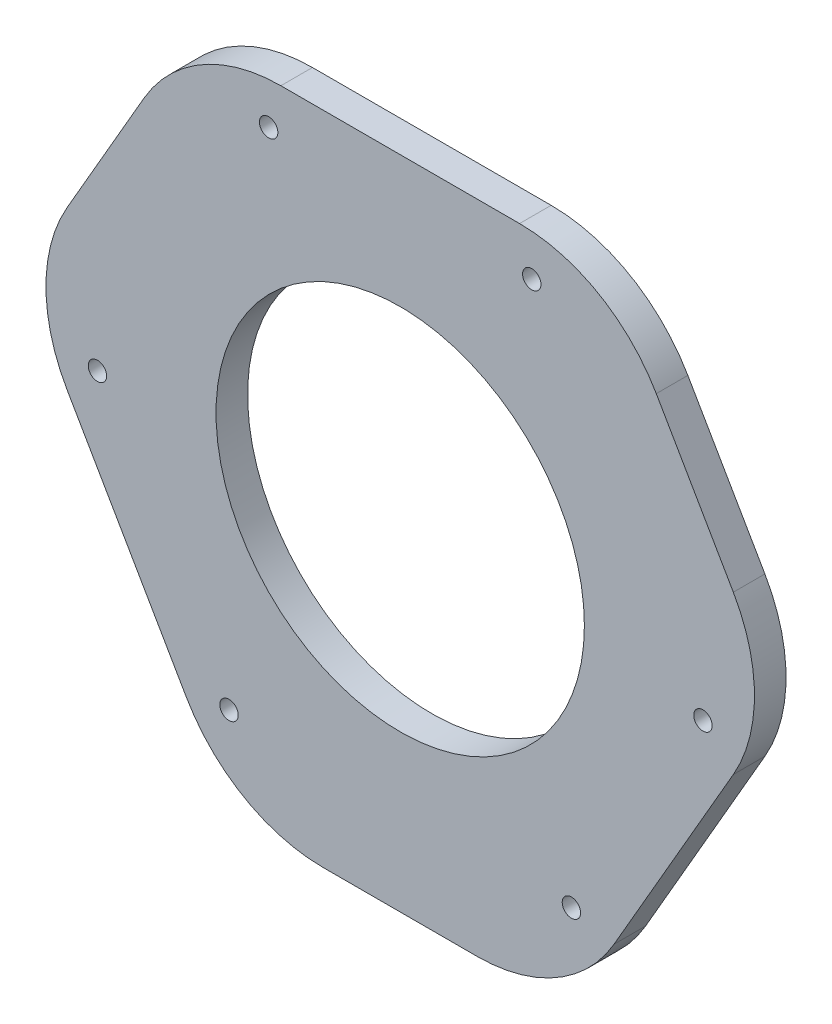
ISO-10303-21;
HEADER;
FILE_DESCRIPTION(('STEP AP214'),'2;1');
FILE_NAME('part.step','',(''),(''),'','','');
FILE_SCHEMA(('AUTOMOTIVE_DESIGN { 1 0 10303 214 1 1 1 1 }'));
ENDSEC;
DATA;
#1=APPLICATION_CONTEXT('core data for automotive mechanical design processes');
#2=APPLICATION_PROTOCOL_DEFINITION('international standard','automotive_design',2000,#1);
#3=PRODUCT_CONTEXT('',#1,'mechanical');
#4=PRODUCT('Part','Part','',(#3));
#5=PRODUCT_RELATED_PRODUCT_CATEGORY('part','',(#4));
#6=PRODUCT_DEFINITION_FORMATION('','',#4);
#7=PRODUCT_DEFINITION_CONTEXT('part definition',#1,'design');
#8=PRODUCT_DEFINITION('design','',#6,#7);
#9=PRODUCT_DEFINITION_SHAPE('','',#8);
#10=(LENGTH_UNIT() NAMED_UNIT(*) SI_UNIT(.MILLI.,.METRE.));
#11=(NAMED_UNIT(*) PLANE_ANGLE_UNIT() SI_UNIT($,.RADIAN.));
#12=(NAMED_UNIT(*) SI_UNIT($,.STERADIAN.) SOLID_ANGLE_UNIT());
#13=UNCERTAINTY_MEASURE_WITH_UNIT(LENGTH_MEASURE(1.E-05),#10,'distance_accuracy_value','');
#14=(GEOMETRIC_REPRESENTATION_CONTEXT(3) GLOBAL_UNCERTAINTY_ASSIGNED_CONTEXT((#13)) GLOBAL_UNIT_ASSIGNED_CONTEXT((#10,
#11,#12)) REPRESENTATION_CONTEXT('',''));
#15=CARTESIAN_POINT('',(0.,0.,0.));
#16=DIRECTION('',(0.,0.,1.));
#17=DIRECTION('',(1.,0.,0.));
#18=AXIS2_PLACEMENT_3D('',#15,#16,#17);
#19=CARTESIAN_POINT('',(0.,0.,6.));
#20=DIRECTION('',(0.,0.,1.));
#21=DIRECTION('',(1.,0.,0.));
#22=AXIS2_PLACEMENT_3D('',#19,#20,#21);
#23=PLANE('',#22);
#24=CARTESIAN_POINT('',(32.5333209967932,-47.6506350946074,6.));
#25=DIRECTION('',(0.,0.,1.));
#26=DIRECTION('',(1.,0.,0.));
#27=AXIS2_PLACEMENT_3D('',#24,#25,#26);
#28=CIRCLE('',#27,1.75);
#29=CARTESIAN_POINT('',(34.2833209967932,-47.6506350946074,6.));
#30=VERTEX_POINT('',#29);
#31=EDGE_CURVE('E283',#30,#30,#28,.F.);
#32=ORIENTED_EDGE('',*,*,#31,.T.);
#33=EDGE_LOOP('',(#32));
#34=FACE_BOUND('',#33,.T.);
#35=CARTESIAN_POINT('',(57.5333209967932,-4.34936490538549,6.));
#36=DIRECTION('',(0.,0.,1.));
#37=DIRECTION('',(1.,0.,0.));
#38=AXIS2_PLACEMENT_3D('',#35,#36,#37);
#39=CIRCLE('',#38,1.75);
#40=CARTESIAN_POINT('',(59.2833209967932,-4.34936490538549,6.));
#41=VERTEX_POINT('',#40);
#42=EDGE_CURVE('E287',#41,#41,#39,.T.);
#43=ORIENTED_EDGE('',*,*,#42,.F.);
#44=EDGE_LOOP('',(#43));
#45=FACE_BOUND('',#44,.T.);
#46=CARTESIAN_POINT('',(0.,0.,6.));
#47=DIRECTION('',(0.,0.,1.));
#48=DIRECTION('',(1.,0.,0.));
#49=AXIS2_PLACEMENT_3D('',#46,#47,#48);
#50=CIRCLE('',#49,35.);
#51=CARTESIAN_POINT('',(35.,0.,6.));
#52=VERTEX_POINT('',#51);
#53=EDGE_CURVE('E291',#52,#52,#50,.T.);
#54=ORIENTED_EDGE('',*,*,#53,.F.);
#55=EDGE_LOOP('',(#54));
#56=FACE_BOUND('',#55,.T.);
#57=CARTESIAN_POINT('',(-25.,52.,6.));
#58=DIRECTION('',(0.,0.,1.));
#59=DIRECTION('',(1.,0.,0.));
#60=AXIS2_PLACEMENT_3D('',#57,#58,#59);
#61=CIRCLE('',#60,1.75);
#62=CARTESIAN_POINT('',(-23.25,52.,6.));
#63=VERTEX_POINT('',#62);
#64=EDGE_CURVE('E295',#63,#63,#61,.T.);
#65=ORIENTED_EDGE('',*,*,#64,.F.);
#66=EDGE_LOOP('',(#65));
#67=FACE_BOUND('',#66,.T.);
#68=CARTESIAN_POINT('',(25.,52.,6.));
#69=DIRECTION('',(0.,0.,1.));
#70=DIRECTION('',(1.,0.,0.));
#71=AXIS2_PLACEMENT_3D('',#68,#69,#70);
#72=CIRCLE('',#71,1.75);
#73=CARTESIAN_POINT('',(26.75,52.,6.));
#74=VERTEX_POINT('',#73);
#75=EDGE_CURVE('E299',#74,#74,#72,.F.);
#76=ORIENTED_EDGE('',*,*,#75,.T.);
#77=EDGE_LOOP('',(#76));
#78=FACE_BOUND('',#77,.T.);
#79=CARTESIAN_POINT('',(-32.5333209967865,-47.6506350946113,6.));
#80=DIRECTION('',(0.,0.,1.));
#81=DIRECTION('',(1.,0.,0.));
#82=AXIS2_PLACEMENT_3D('',#79,#80,#81);
#83=CIRCLE('',#82,1.75);
#84=CARTESIAN_POINT('',(-30.7833209967865,-47.6506350946113,6.));
#85=VERTEX_POINT('',#84);
#86=EDGE_CURVE('E302',#85,#85,#83,.T.);
#87=ORIENTED_EDGE('',*,*,#86,.F.);
#88=EDGE_LOOP('',(#87));
#89=FACE_BOUND('',#88,.T.);
#90=CARTESIAN_POINT('',(-57.5333209967866,-4.34936490538938,6.));
#91=DIRECTION('',(0.,0.,1.));
#92=DIRECTION('',(1.,0.,0.));
#93=AXIS2_PLACEMENT_3D('',#90,#91,#92);
#94=CIRCLE('',#93,1.75);
#95=CARTESIAN_POINT('',(-55.7833209967865,-4.34936490538938,6.));
#96=VERTEX_POINT('',#95);
#97=EDGE_CURVE('E228',#96,#96,#94,.F.);
#98=ORIENTED_EDGE('',*,*,#97,.T.);
#99=EDGE_LOOP('',(#98));
#100=FACE_BOUND('',#99,.T.);
#101=DIRECTION('',(-0.5,-0.866025403784439,0.));
#102=VECTOR('',#101,1.);
#103=CARTESIAN_POINT('',(-55.9807621135332,32.3205080756888,6.));
#104=LINE('',#103,#102);
#105=CARTESIAN_POINT('',(-48.6602540378444,45.,6.));
#106=VERTEX_POINT('',#105);
#107=CARTESIAN_POINT('',(-63.3012701892218,19.6410161513778,6.));
#108=VERTEX_POINT('',#107);
#109=EDGE_CURVE('E260',#106,#108,#104,.T.);
#110=ORIENTED_EDGE('',*,*,#109,.T.);
#111=CARTESIAN_POINT('',(-37.3205080756887,4.6410161513779,6.));
#112=DIRECTION('',(0.,0.,1.));
#113=DIRECTION('',(-0.499999999999992,0.866025403784443,0.));
#114=AXIS2_PLACEMENT_3D('',#111,#112,#113);
#115=CIRCLE('',#114,30.);
#116=CARTESIAN_POINT('',(-63.301270189222,-10.3589838486219,6.));
#117=VERTEX_POINT('',#116);
#118=EDGE_CURVE('E60',#108,#117,#115,.T.);
#119=ORIENTED_EDGE('',*,*,#118,.T.);
#120=DIRECTION('',(-0.5,0.866025403784438,0.));
#121=VECTOR('',#120,1.);
#122=CARTESIAN_POINT('',(-51.9615242270641,-29.9999999999987,6.));
#123=LINE('',#122,#121);
#124=CARTESIAN_POINT('',(-40.6217782649111,-49.6410161513772,6.));
#125=VERTEX_POINT('',#124);
#126=EDGE_CURVE('E267',#125,#117,#123,.T.);
#127=ORIENTED_EDGE('',*,*,#126,.F.);
#128=CARTESIAN_POINT('',(-14.6410161513779,-34.6410161513774,6.));
#129=DIRECTION('',(0.,0.,1.));
#130=DIRECTION('',(-0.499999999999992,0.866025403784443,0.));
#131=AXIS2_PLACEMENT_3D('',#128,#129,#130);
#132=CIRCLE('',#131,30.);
#133=CARTESIAN_POINT('',(-14.6410161513781,-64.6410161513774,6.));
#134=VERTEX_POINT('',#133);
#135=EDGE_CURVE('E358',#125,#134,#132,.T.);
#136=ORIENTED_EDGE('',*,*,#135,.T.);
#137=DIRECTION('',(1.,0.,0.));
#138=VECTOR('',#137,1.);
#139=CARTESIAN_POINT('',(0.,-64.641016151375,6.));
#140=LINE('',#139,#138);
#141=CARTESIAN_POINT('',(14.6410161513772,-64.6410161513776,6.));
#142=VERTEX_POINT('',#141);
#143=EDGE_CURVE('E272',#134,#142,#140,.T.);
#144=ORIENTED_EDGE('',*,*,#143,.T.);
#145=CARTESIAN_POINT('',(14.6410161513774,-34.6410161513776,6.));
#146=DIRECTION('',(0.,0.,1.));
#147=DIRECTION('',(-0.500000000000004,-0.866025403784436,0.));
#148=AXIS2_PLACEMENT_3D('',#145,#146,#147);
#149=CIRCLE('',#148,30.);
#150=CARTESIAN_POINT('',(40.6217782649105,-49.6410161513777,6.));
#151=VERTEX_POINT('',#150);
#152=EDGE_CURVE('E342',#142,#151,#149,.T.);
#153=ORIENTED_EDGE('',*,*,#152,.T.);
#154=DIRECTION('',(-0.5,-0.866025403784439,0.));
#155=VECTOR('',#154,1.);
#156=CARTESIAN_POINT('',(51.9615242270641,-29.9999999999987,6.));
#157=LINE('',#156,#155);
#158=CARTESIAN_POINT('',(63.3012701892219,-10.3589838486227,6.));
#159=VERTEX_POINT('',#158);
#160=EDGE_CURVE('E279',#159,#151,#157,.T.);
#161=ORIENTED_EDGE('',*,*,#160,.F.);
#162=CARTESIAN_POINT('',(37.3205080756888,4.64101615137739,6.));
#163=DIRECTION('',(0.,0.,1.));
#164=DIRECTION('',(-0.500000000000004,-0.866025403784436,0.));
#165=AXIS2_PLACEMENT_3D('',#162,#163,#164);
#166=CIRCLE('',#165,30.);
#167=CARTESIAN_POINT('',(63.301270189222,19.6410161513773,6.));
#168=VERTEX_POINT('',#167);
#169=EDGE_CURVE('E323',#159,#168,#166,.T.);
#170=ORIENTED_EDGE('',*,*,#169,.T.);
#171=DIRECTION('',(-0.5,0.866025403784439,0.));
#172=VECTOR('',#171,1.);
#173=CARTESIAN_POINT('',(55.9807621135332,32.3205080756888,6.));
#174=LINE('',#173,#172);
#175=CARTESIAN_POINT('',(48.6602540378444,45.,6.));
#176=VERTEX_POINT('',#175);
#177=EDGE_CURVE('E223',#168,#176,#174,.T.);
#178=ORIENTED_EDGE('',*,*,#177,.T.);
#179=CARTESIAN_POINT('',(22.6794919243112,30.,6.));
#180=DIRECTION('',(0.,0.,1.));
#181=DIRECTION('',(1.,0.,0.));
#182=AXIS2_PLACEMENT_3D('',#179,#180,#181);
#183=CIRCLE('',#182,30.);
#184=CARTESIAN_POINT('',(22.6794919243112,60.,6.));
#185=VERTEX_POINT('',#184);
#186=EDGE_CURVE('E51',#176,#185,#183,.T.);
#187=ORIENTED_EDGE('',*,*,#186,.T.);
#188=DIRECTION('',(1.,0.,0.));
#189=VECTOR('',#188,1.);
#190=CARTESIAN_POINT('',(0.,60.,6.));
#191=LINE('',#190,#189);
#192=CARTESIAN_POINT('',(-22.6794919243112,60.,6.));
#193=VERTEX_POINT('',#192);
#194=EDGE_CURVE('E248',#193,#185,#191,.T.);
#195=ORIENTED_EDGE('',*,*,#194,.F.);
#196=CARTESIAN_POINT('',(-22.6794919243112,30.,6.));
#197=DIRECTION('',(0.,0.,1.));
#198=DIRECTION('',(1.,0.,0.));
#199=AXIS2_PLACEMENT_3D('',#196,#197,#198);
#200=CIRCLE('',#199,30.);
#201=EDGE_CURVE('E241',#193,#106,#200,.T.);
#202=ORIENTED_EDGE('',*,*,#201,.T.);
#203=EDGE_LOOP('',(#110,#119,#127,#136,#144,#153,#161,#170,#178,#187,#195,#202));
#204=FACE_BOUND('',#203,.T.);
#205=ADVANCED_FACE('F42',(#34,#45,#56,#67,#78,#89,#100,#204),#23,.T.);
#206=CARTESIAN_POINT('',(0.,0.,0.));
#207=DIRECTION('',(0.,0.,1.));
#208=DIRECTION('',(1.,0.,0.));
#209=AXIS2_PLACEMENT_3D('',#206,#207,#208);
#210=PLANE('',#209);
#211=CARTESIAN_POINT('',(32.5333209967932,-47.6506350946074,0.));
#212=DIRECTION('',(0.,0.,1.));
#213=DIRECTION('',(1.,0.,0.));
#214=AXIS2_PLACEMENT_3D('',#211,#212,#213);
#215=CIRCLE('',#214,1.75);
#216=CARTESIAN_POINT('',(34.2833209967932,-47.6506350946074,0.));
#217=VERTEX_POINT('',#216);
#218=EDGE_CURVE('E195',#217,#217,#215,.F.);
#219=ORIENTED_EDGE('',*,*,#218,.F.);
#220=EDGE_LOOP('',(#219));
#221=FACE_BOUND('',#220,.T.);
#222=CARTESIAN_POINT('',(57.5333209967932,-4.34936490538549,0.));
#223=DIRECTION('',(0.,0.,1.));
#224=DIRECTION('',(1.,0.,0.));
#225=AXIS2_PLACEMENT_3D('',#222,#223,#224);
#226=CIRCLE('',#225,1.75);
#227=CARTESIAN_POINT('',(59.2833209967932,-4.34936490538549,0.));
#228=VERTEX_POINT('',#227);
#229=EDGE_CURVE('E199',#228,#228,#226,.T.);
#230=ORIENTED_EDGE('',*,*,#229,.T.);
#231=EDGE_LOOP('',(#230));
#232=FACE_BOUND('',#231,.T.);
#233=CARTESIAN_POINT('',(0.,0.,0.));
#234=DIRECTION('',(0.,0.,1.));
#235=DIRECTION('',(1.,0.,0.));
#236=AXIS2_PLACEMENT_3D('',#233,#234,#235);
#237=CIRCLE('',#236,35.);
#238=CARTESIAN_POINT('',(35.,0.,0.));
#239=VERTEX_POINT('',#238);
#240=EDGE_CURVE('E203',#239,#239,#237,.T.);
#241=ORIENTED_EDGE('',*,*,#240,.T.);
#242=EDGE_LOOP('',(#241));
#243=FACE_BOUND('',#242,.T.);
#244=CARTESIAN_POINT('',(-25.,52.,0.));
#245=DIRECTION('',(0.,0.,1.));
#246=DIRECTION('',(1.,0.,0.));
#247=AXIS2_PLACEMENT_3D('',#244,#245,#246);
#248=CIRCLE('',#247,1.75);
#249=CARTESIAN_POINT('',(-23.25,52.,0.));
#250=VERTEX_POINT('',#249);
#251=EDGE_CURVE('E207',#250,#250,#248,.T.);
#252=ORIENTED_EDGE('',*,*,#251,.T.);
#253=EDGE_LOOP('',(#252));
#254=FACE_BOUND('',#253,.T.);
#255=CARTESIAN_POINT('',(25.,52.,0.));
#256=DIRECTION('',(0.,0.,1.));
#257=DIRECTION('',(1.,0.,0.));
#258=AXIS2_PLACEMENT_3D('',#255,#256,#257);
#259=CIRCLE('',#258,1.75);
#260=CARTESIAN_POINT('',(26.75,52.,0.));
#261=VERTEX_POINT('',#260);
#262=EDGE_CURVE('E211',#261,#261,#259,.F.);
#263=ORIENTED_EDGE('',*,*,#262,.F.);
#264=EDGE_LOOP('',(#263));
#265=FACE_BOUND('',#264,.T.);
#266=CARTESIAN_POINT('',(-32.5333209967865,-47.6506350946113,0.));
#267=DIRECTION('',(0.,0.,1.));
#268=DIRECTION('',(1.,0.,0.));
#269=AXIS2_PLACEMENT_3D('',#266,#267,#268);
#270=CIRCLE('',#269,1.75);
#271=CARTESIAN_POINT('',(-30.7833209967865,-47.6506350946113,0.));
#272=VERTEX_POINT('',#271);
#273=EDGE_CURVE('E215',#272,#272,#270,.T.);
#274=ORIENTED_EDGE('',*,*,#273,.T.);
#275=EDGE_LOOP('',(#274));
#276=FACE_BOUND('',#275,.T.);
#277=CARTESIAN_POINT('',(-57.5333209967866,-4.34936490538938,0.));
#278=DIRECTION('',(0.,0.,1.));
#279=DIRECTION('',(1.,0.,0.));
#280=AXIS2_PLACEMENT_3D('',#277,#278,#279);
#281=CIRCLE('',#280,1.75);
#282=CARTESIAN_POINT('',(-55.7833209967865,-4.34936490538938,0.));
#283=VERTEX_POINT('',#282);
#284=EDGE_CURVE('E219',#283,#283,#281,.F.);
#285=ORIENTED_EDGE('',*,*,#284,.F.);
#286=EDGE_LOOP('',(#285));
#287=FACE_BOUND('',#286,.T.);
#288=CARTESIAN_POINT('',(-37.3205080756887,4.6410161513779,0.));
#289=DIRECTION('',(0.,0.,1.));
#290=DIRECTION('',(-0.499999999999992,0.866025403784443,0.));
#291=AXIS2_PLACEMENT_3D('',#288,#289,#290);
#292=CIRCLE('',#291,30.);
#293=CARTESIAN_POINT('',(-63.301270189222,-10.3589838486219,0.));
#294=VERTEX_POINT('',#293);
#295=CARTESIAN_POINT('',(-63.3012701892217,19.6410161513781,0.));
#296=VERTEX_POINT('',#295);
#297=EDGE_CURVE('E153',#294,#296,#292,.F.);
#298=ORIENTED_EDGE('',*,*,#297,.T.);
#299=DIRECTION('',(-0.5,-0.866025403784439,0.));
#300=VECTOR('',#299,1.);
#301=CARTESIAN_POINT('',(-55.9807621135332,32.3205080756888,0.));
#302=LINE('',#301,#300);
#303=CARTESIAN_POINT('',(-48.6602540378444,45.,0.));
#304=VERTEX_POINT('',#303);
#305=EDGE_CURVE('E165',#304,#296,#302,.T.);
#306=ORIENTED_EDGE('',*,*,#305,.F.);
#307=CARTESIAN_POINT('',(-22.6794919243112,30.,0.));
#308=DIRECTION('',(0.,0.,1.));
#309=DIRECTION('',(1.,0.,0.));
#310=AXIS2_PLACEMENT_3D('',#307,#308,#309);
#311=CIRCLE('',#310,30.);
#312=CARTESIAN_POINT('',(-22.6794919243112,60.,0.));
#313=VERTEX_POINT('',#312);
#314=EDGE_CURVE('E232',#304,#313,#311,.F.);
#315=ORIENTED_EDGE('',*,*,#314,.T.);
#316=DIRECTION('',(1.,0.,0.));
#317=VECTOR('',#316,1.);
#318=CARTESIAN_POINT('',(0.,60.,0.));
#319=LINE('',#318,#317);
#320=CARTESIAN_POINT('',(22.6794919243112,60.,0.));
#321=VERTEX_POINT('',#320);
#322=EDGE_CURVE('E175',#313,#321,#319,.T.);
#323=ORIENTED_EDGE('',*,*,#322,.T.);
#324=CARTESIAN_POINT('',(22.6794919243112,30.,0.));
#325=DIRECTION('',(0.,0.,1.));
#326=DIRECTION('',(1.,0.,0.));
#327=AXIS2_PLACEMENT_3D('',#324,#325,#326);
#328=CIRCLE('',#327,30.);
#329=CARTESIAN_POINT('',(48.6602540378444,45.,0.));
#330=VERTEX_POINT('',#329);
#331=EDGE_CURVE('E234',#321,#330,#328,.F.);
#332=ORIENTED_EDGE('',*,*,#331,.T.);
#333=DIRECTION('',(-0.5,0.866025403784439,0.));
#334=VECTOR('',#333,1.);
#335=CARTESIAN_POINT('',(55.9807621135332,32.3205080756888,0.));
#336=LINE('',#335,#334);
#337=CARTESIAN_POINT('',(63.301270189222,19.6410161513773,0.));
#338=VERTEX_POINT('',#337);
#339=EDGE_CURVE('E184',#338,#330,#336,.T.);
#340=ORIENTED_EDGE('',*,*,#339,.F.);
#341=CARTESIAN_POINT('',(37.3205080756888,4.64101615137739,0.));
#342=DIRECTION('',(0.,0.,1.));
#343=DIRECTION('',(-0.500000000000004,-0.866025403784436,0.));
#344=AXIS2_PLACEMENT_3D('',#341,#342,#343);
#345=CIRCLE('',#344,30.);
#346=CARTESIAN_POINT('',(63.3012701892197,-10.3589838486213,0.));
#347=VERTEX_POINT('',#346);
#348=EDGE_CURVE('E313',#338,#347,#345,.F.);
#349=ORIENTED_EDGE('',*,*,#348,.T.);
#350=DIRECTION('',(-0.5,-0.866025403784439,0.));
#351=VECTOR('',#350,1.);
#352=CARTESIAN_POINT('',(51.9615242270641,-29.9999999999987,0.));
#353=LINE('',#352,#351);
#354=CARTESIAN_POINT('',(40.6217782649084,-49.6410161513764,0.));
#355=VERTEX_POINT('',#354);
#356=EDGE_CURVE('E191',#347,#355,#353,.T.);
#357=ORIENTED_EDGE('',*,*,#356,.T.);
#358=CARTESIAN_POINT('',(14.6410161513774,-34.6410161513776,0.));
#359=DIRECTION('',(0.,0.,1.));
#360=DIRECTION('',(-0.500000000000004,-0.866025403784436,0.));
#361=AXIS2_PLACEMENT_3D('',#358,#359,#360);
#362=CIRCLE('',#361,30.);
#363=CARTESIAN_POINT('',(14.6410161513772,-64.6410161513776,0.));
#364=VERTEX_POINT('',#363);
#365=EDGE_CURVE('E70',#355,#364,#362,.F.);
#366=ORIENTED_EDGE('',*,*,#365,.T.);
#367=DIRECTION('',(1.,0.,0.));
#368=VECTOR('',#367,1.);
#369=CARTESIAN_POINT('',(0.,-64.641016151375,0.));
#370=LINE('',#369,#368);
#371=CARTESIAN_POINT('',(-14.6410161513779,-64.641016151375,0.));
#372=VERTEX_POINT('',#371);
#373=EDGE_CURVE('E180',#372,#364,#370,.T.);
#374=ORIENTED_EDGE('',*,*,#373,.F.);
#375=CARTESIAN_POINT('',(-14.6410161513779,-34.6410161513774,0.));
#376=DIRECTION('',(0.,0.,1.));
#377=DIRECTION('',(-0.499999999999992,0.866025403784443,0.));
#378=AXIS2_PLACEMENT_3D('',#375,#376,#377);
#379=CIRCLE('',#378,30.);
#380=CARTESIAN_POINT('',(-40.6217782649111,-49.6410161513772,0.));
#381=VERTEX_POINT('',#380);
#382=EDGE_CURVE('E324',#372,#381,#379,.F.);
#383=ORIENTED_EDGE('',*,*,#382,.T.);
#384=DIRECTION('',(-0.5,0.866025403784438,0.));
#385=VECTOR('',#384,1.);
#386=CARTESIAN_POINT('',(-51.9615242270641,-29.9999999999987,0.));
#387=LINE('',#386,#385);
#388=EDGE_CURVE('E168',#381,#294,#387,.T.);
#389=ORIENTED_EDGE('',*,*,#388,.T.);
#390=EDGE_LOOP('',(#298,#306,#315,#323,#332,#340,#349,#357,#366,#374,#383,#389));
#391=FACE_BOUND('',#390,.T.);
#392=ADVANCED_FACE('F164',(#221,#232,#243,#254,#265,#276,#287,#391),#210,.F.);
#393=CARTESIAN_POINT('',(-51.9615242270641,-29.9999999999987,6.));
#394=DIRECTION('',(-0.866025403784438,-0.5,0.));
#395=DIRECTION('',(0.5,-0.866025403784439,0.));
#396=AXIS2_PLACEMENT_3D('',#393,#394,#395);
#397=PLANE('',#396);
#398=DIRECTION('',(0.,0.,-1.));
#399=VECTOR('',#398,1.);
#400=CARTESIAN_POINT('',(-63.301270189222,-10.3589838486219,0.));
#401=LINE('',#400,#399);
#402=EDGE_CURVE('E170',#117,#294,#401,.T.);
#403=ORIENTED_EDGE('',*,*,#402,.T.);
#404=ORIENTED_EDGE('',*,*,#388,.F.);
#405=DIRECTION('',(0.,0.,-1.));
#406=VECTOR('',#405,1.);
#407=CARTESIAN_POINT('',(-40.6217782649111,-49.6410161513772,6.));
#408=LINE('',#407,#406);
#409=EDGE_CURVE('E331',#381,#125,#408,.F.);
#410=ORIENTED_EDGE('',*,*,#409,.T.);
#411=ORIENTED_EDGE('',*,*,#126,.T.);
#412=EDGE_LOOP('',(#403,#404,#410,#411));
#413=FACE_BOUND('',#412,.T.);
#414=ADVANCED_FACE('F364',(#413),#397,.T.);
#415=CARTESIAN_POINT('',(0.,-64.641016151375,6.));
#416=DIRECTION('',(0.,1.,0.));
#417=DIRECTION('',(0.,0.,1.));
#418=AXIS2_PLACEMENT_3D('',#415,#416,#417);
#419=PLANE('',#418);
#420=ORIENTED_EDGE('',*,*,#373,.T.);
#421=DIRECTION('',(0.,0.,-1.));
#422=VECTOR('',#421,1.);
#423=CARTESIAN_POINT('',(14.6410161513772,-64.6410161513776,6.));
#424=LINE('',#423,#422);
#425=EDGE_CURVE('E346',#364,#142,#424,.F.);
#426=ORIENTED_EDGE('',*,*,#425,.T.);
#427=ORIENTED_EDGE('',*,*,#143,.F.);
#428=DIRECTION('',(0.,0.,-1.));
#429=VECTOR('',#428,1.);
#430=CARTESIAN_POINT('',(-14.6410161513781,-64.6410161513774,0.));
#431=LINE('',#430,#429);
#432=EDGE_CURVE('E321',#134,#372,#431,.T.);
#433=ORIENTED_EDGE('',*,*,#432,.T.);
#434=EDGE_LOOP('',(#420,#426,#427,#433));
#435=FACE_BOUND('',#434,.T.);
#436=ADVANCED_FACE('F368',(#435),#419,.F.);
#437=CARTESIAN_POINT('',(55.9807621135332,32.3205080756888,6.));
#438=DIRECTION('',(-0.866025403784439,-0.5,0.));
#439=DIRECTION('',(0.5,-0.866025403784439,0.));
#440=AXIS2_PLACEMENT_3D('',#437,#438,#439);
#441=PLANE('',#440);
#442=DIRECTION('',(0.,0.,-1.));
#443=VECTOR('',#442,1.);
#444=CARTESIAN_POINT('',(63.301270189222,19.6410161513773,0.));
#445=LINE('',#444,#443);
#446=EDGE_CURVE('E308',#168,#338,#445,.T.);
#447=ORIENTED_EDGE('',*,*,#446,.T.);
#448=ORIENTED_EDGE('',*,*,#339,.T.);
#449=DIRECTION('',(0.,0.,-1.));
#450=VECTOR('',#449,1.);
#451=CARTESIAN_POINT('',(48.6602540378444,45.,6.));
#452=LINE('',#451,#450);
#453=EDGE_CURVE('E238',#330,#176,#452,.F.);
#454=ORIENTED_EDGE('',*,*,#453,.T.);
#455=ORIENTED_EDGE('',*,*,#177,.F.);
#456=EDGE_LOOP('',(#447,#448,#454,#455));
#457=FACE_BOUND('',#456,.T.);
#458=ADVANCED_FACE('F419',(#457),#441,.F.);
#459=CARTESIAN_POINT('',(51.9615242270641,-29.9999999999987,6.));
#460=DIRECTION('',(0.866025403784439,-0.5,0.));
#461=DIRECTION('',(0.5,0.866025403784439,0.));
#462=AXIS2_PLACEMENT_3D('',#459,#460,#461);
#463=PLANE('',#462);
#464=DIRECTION('',(0.,0.,-1.));
#465=VECTOR('',#464,1.);
#466=CARTESIAN_POINT('',(40.6217782649105,-49.6410161513777,0.));
#467=LINE('',#466,#465);
#468=EDGE_CURVE('E355',#151,#355,#467,.T.);
#469=ORIENTED_EDGE('',*,*,#468,.T.);
#470=ORIENTED_EDGE('',*,*,#356,.F.);
#471=DIRECTION('',(0.,0.,-1.));
#472=VECTOR('',#471,1.);
#473=CARTESIAN_POINT('',(63.3012701892219,-10.3589838486227,6.));
#474=LINE('',#473,#472);
#475=EDGE_CURVE('E317',#347,#159,#474,.F.);
#476=ORIENTED_EDGE('',*,*,#475,.T.);
#477=ORIENTED_EDGE('',*,*,#160,.T.);
#478=EDGE_LOOP('',(#469,#470,#476,#477));
#479=FACE_BOUND('',#478,.T.);
#480=ADVANCED_FACE('F339',(#479),#463,.T.);
#481=CARTESIAN_POINT('',(0.,60.,6.));
#482=DIRECTION('',(0.,1.,0.));
#483=DIRECTION('',(0.,0.,1.));
#484=AXIS2_PLACEMENT_3D('',#481,#482,#483);
#485=PLANE('',#484);
#486=ORIENTED_EDGE('',*,*,#194,.T.);
#487=DIRECTION('',(0.,0.,-1.));
#488=VECTOR('',#487,1.);
#489=CARTESIAN_POINT('',(22.6794919243112,60.,0.));
#490=LINE('',#489,#488);
#491=EDGE_CURVE('E227',#185,#321,#490,.T.);
#492=ORIENTED_EDGE('',*,*,#491,.T.);
#493=ORIENTED_EDGE('',*,*,#322,.F.);
#494=DIRECTION('',(0.,0.,-1.));
#495=VECTOR('',#494,1.);
#496=CARTESIAN_POINT('',(-22.6794919243112,60.,6.));
#497=LINE('',#496,#495);
#498=EDGE_CURVE('E224',#313,#193,#497,.F.);
#499=ORIENTED_EDGE('',*,*,#498,.T.);
#500=EDGE_LOOP('',(#486,#492,#493,#499));
#501=FACE_BOUND('',#500,.T.);
#502=ADVANCED_FACE('F256',(#501),#485,.T.);
#503=CARTESIAN_POINT('',(-55.9807621135332,32.3205080756888,6.));
#504=DIRECTION('',(0.866025403784438,-0.5,0.));
#505=DIRECTION('',(0.5,0.866025403784439,0.));
#506=AXIS2_PLACEMENT_3D('',#503,#504,#505);
#507=PLANE('',#506);
#508=ORIENTED_EDGE('',*,*,#305,.T.);
#509=DIRECTION('',(0.,0.,-1.));
#510=VECTOR('',#509,1.);
#511=CARTESIAN_POINT('',(-63.3012701892217,19.6410161513781,6.));
#512=LINE('',#511,#510);
#513=EDGE_CURVE('E150',#296,#108,#512,.F.);
#514=ORIENTED_EDGE('',*,*,#513,.T.);
#515=ORIENTED_EDGE('',*,*,#109,.F.);
#516=DIRECTION('',(0.,0.,-1.));
#517=VECTOR('',#516,1.);
#518=CARTESIAN_POINT('',(-48.6602540378444,45.,0.));
#519=LINE('',#518,#517);
#520=EDGE_CURVE('E11',#106,#304,#519,.T.);
#521=ORIENTED_EDGE('',*,*,#520,.T.);
#522=EDGE_LOOP('',(#508,#514,#515,#521));
#523=FACE_BOUND('',#522,.T.);
#524=ADVANCED_FACE('F172',(#523),#507,.F.);
#525=CARTESIAN_POINT('',(-32.5333209967865,-47.6506350946113,6.));
#526=DIRECTION('',(0.,0.,-1.));
#527=DIRECTION('',(-1.,0.,0.));
#528=AXIS2_PLACEMENT_3D('',#525,#526,#527);
#529=CYLINDRICAL_SURFACE('',#528,1.75);
#530=ORIENTED_EDGE('',*,*,#86,.T.);
#531=EDGE_LOOP('',(#530));
#532=FACE_BOUND('',#531,.T.);
#533=ORIENTED_EDGE('',*,*,#273,.F.);
#534=EDGE_LOOP('',(#533));
#535=FACE_BOUND('',#534,.T.);
#536=ADVANCED_FACE('F394',(#532,#535),#529,.F.);
#537=CARTESIAN_POINT('',(25.,52.,6.));
#538=DIRECTION('',(0.,0.,-1.));
#539=DIRECTION('',(-1.,0.,0.));
#540=AXIS2_PLACEMENT_3D('',#537,#538,#539);
#541=CYLINDRICAL_SURFACE('',#540,1.75);
#542=ORIENTED_EDGE('',*,*,#75,.F.);
#543=EDGE_LOOP('',(#542));
#544=FACE_BOUND('',#543,.T.);
#545=ORIENTED_EDGE('',*,*,#262,.T.);
#546=EDGE_LOOP('',(#545));
#547=FACE_BOUND('',#546,.T.);
#548=ADVANCED_FACE('F397',(#544,#547),#541,.F.);
#549=CARTESIAN_POINT('',(-25.,52.,6.));
#550=DIRECTION('',(0.,0.,-1.));
#551=DIRECTION('',(-1.,0.,0.));
#552=AXIS2_PLACEMENT_3D('',#549,#550,#551);
#553=CYLINDRICAL_SURFACE('',#552,1.75);
#554=ORIENTED_EDGE('',*,*,#64,.T.);
#555=EDGE_LOOP('',(#554));
#556=FACE_BOUND('',#555,.T.);
#557=ORIENTED_EDGE('',*,*,#251,.F.);
#558=EDGE_LOOP('',(#557));
#559=FACE_BOUND('',#558,.T.);
#560=ADVANCED_FACE('F401',(#556,#559),#553,.F.);
#561=CARTESIAN_POINT('',(0.,0.,6.));
#562=DIRECTION('',(0.,0.,-1.));
#563=DIRECTION('',(-1.,0.,0.));
#564=AXIS2_PLACEMENT_3D('',#561,#562,#563);
#565=CYLINDRICAL_SURFACE('',#564,35.);
#566=ORIENTED_EDGE('',*,*,#53,.T.);
#567=EDGE_LOOP('',(#566));
#568=FACE_BOUND('',#567,.T.);
#569=ORIENTED_EDGE('',*,*,#240,.F.);
#570=EDGE_LOOP('',(#569));
#571=FACE_BOUND('',#570,.T.);
#572=ADVANCED_FACE('F405',(#568,#571),#565,.F.);
#573=CARTESIAN_POINT('',(57.5333209967932,-4.34936490538549,6.));
#574=DIRECTION('',(0.,0.,-1.));
#575=DIRECTION('',(-1.,0.,0.));
#576=AXIS2_PLACEMENT_3D('',#573,#574,#575);
#577=CYLINDRICAL_SURFACE('',#576,1.75);
#578=ORIENTED_EDGE('',*,*,#42,.T.);
#579=EDGE_LOOP('',(#578));
#580=FACE_BOUND('',#579,.T.);
#581=ORIENTED_EDGE('',*,*,#229,.F.);
#582=EDGE_LOOP('',(#581));
#583=FACE_BOUND('',#582,.T.);
#584=ADVANCED_FACE('F409',(#580,#583),#577,.F.);
#585=CARTESIAN_POINT('',(32.5333209967932,-47.6506350946074,6.));
#586=DIRECTION('',(0.,0.,-1.));
#587=DIRECTION('',(-1.,0.,0.));
#588=AXIS2_PLACEMENT_3D('',#585,#586,#587);
#589=CYLINDRICAL_SURFACE('',#588,1.75);
#590=ORIENTED_EDGE('',*,*,#31,.F.);
#591=EDGE_LOOP('',(#590));
#592=FACE_BOUND('',#591,.T.);
#593=ORIENTED_EDGE('',*,*,#218,.T.);
#594=EDGE_LOOP('',(#593));
#595=FACE_BOUND('',#594,.T.);
#596=ADVANCED_FACE('F392',(#592,#595),#589,.F.);
#597=CARTESIAN_POINT('',(-57.5333209967866,-4.34936490538938,6.));
#598=DIRECTION('',(0.,0.,-1.));
#599=DIRECTION('',(-1.,0.,0.));
#600=AXIS2_PLACEMENT_3D('',#597,#598,#599);
#601=CYLINDRICAL_SURFACE('',#600,1.75);
#602=ORIENTED_EDGE('',*,*,#97,.F.);
#603=EDGE_LOOP('',(#602));
#604=FACE_BOUND('',#603,.T.);
#605=ORIENTED_EDGE('',*,*,#284,.T.);
#606=EDGE_LOOP('',(#605));
#607=FACE_BOUND('',#606,.T.);
#608=ADVANCED_FACE('F389',(#604,#607),#601,.F.);
#609=CARTESIAN_POINT('',(22.6794919243112,30.,6.));
#610=DIRECTION('',(0.,0.,1.));
#611=DIRECTION('',(1.,0.,0.));
#612=AXIS2_PLACEMENT_3D('',#609,#610,#611);
#613=CYLINDRICAL_SURFACE('',#612,30.);
#614=ORIENTED_EDGE('',*,*,#186,.F.);
#615=ORIENTED_EDGE('',*,*,#453,.F.);
#616=ORIENTED_EDGE('',*,*,#331,.F.);
#617=ORIENTED_EDGE('',*,*,#491,.F.);
#618=EDGE_LOOP('',(#614,#615,#616,#617));
#619=FACE_BOUND('',#618,.T.);
#620=ADVANCED_FACE('F262',(#619),#613,.T.);
#621=CARTESIAN_POINT('',(-22.6794919243112,30.,6.));
#622=DIRECTION('',(0.,0.,1.));
#623=DIRECTION('',(1.,0.,0.));
#624=AXIS2_PLACEMENT_3D('',#621,#622,#623);
#625=CYLINDRICAL_SURFACE('',#624,30.);
#626=ORIENTED_EDGE('',*,*,#201,.F.);
#627=ORIENTED_EDGE('',*,*,#498,.F.);
#628=ORIENTED_EDGE('',*,*,#314,.F.);
#629=ORIENTED_EDGE('',*,*,#520,.F.);
#630=EDGE_LOOP('',(#626,#627,#628,#629));
#631=FACE_BOUND('',#630,.T.);
#632=ADVANCED_FACE('F44',(#631),#625,.T.);
#633=CARTESIAN_POINT('',(37.3205080756888,4.64101615137739,6.));
#634=DIRECTION('',(0.,0.,1.));
#635=DIRECTION('',(-0.500000000000004,-0.866025403784436,0.));
#636=AXIS2_PLACEMENT_3D('',#633,#634,#635);
#637=CYLINDRICAL_SURFACE('',#636,30.);
#638=ORIENTED_EDGE('',*,*,#169,.F.);
#639=ORIENTED_EDGE('',*,*,#475,.F.);
#640=ORIENTED_EDGE('',*,*,#348,.F.);
#641=ORIENTED_EDGE('',*,*,#446,.F.);
#642=EDGE_LOOP('',(#638,#639,#640,#641));
#643=FACE_BOUND('',#642,.T.);
#644=ADVANCED_FACE('F370',(#643),#637,.T.);
#645=CARTESIAN_POINT('',(-14.6410161513779,-34.6410161513774,6.));
#646=DIRECTION('',(0.,0.,1.));
#647=DIRECTION('',(-0.499999999999992,0.866025403784443,0.));
#648=AXIS2_PLACEMENT_3D('',#645,#646,#647);
#649=CYLINDRICAL_SURFACE('',#648,30.);
#650=ORIENTED_EDGE('',*,*,#135,.F.);
#651=ORIENTED_EDGE('',*,*,#409,.F.);
#652=ORIENTED_EDGE('',*,*,#382,.F.);
#653=ORIENTED_EDGE('',*,*,#432,.F.);
#654=EDGE_LOOP('',(#650,#651,#652,#653));
#655=FACE_BOUND('',#654,.T.);
#656=ADVANCED_FACE('F372',(#655),#649,.T.);
#657=CARTESIAN_POINT('',(14.6410161513774,-34.6410161513776,6.));
#658=DIRECTION('',(0.,0.,1.));
#659=DIRECTION('',(-0.500000000000004,-0.866025403784436,0.));
#660=AXIS2_PLACEMENT_3D('',#657,#658,#659);
#661=CYLINDRICAL_SURFACE('',#660,30.);
#662=ORIENTED_EDGE('',*,*,#152,.F.);
#663=ORIENTED_EDGE('',*,*,#425,.F.);
#664=ORIENTED_EDGE('',*,*,#365,.F.);
#665=ORIENTED_EDGE('',*,*,#468,.F.);
#666=EDGE_LOOP('',(#662,#663,#664,#665));
#667=FACE_BOUND('',#666,.T.);
#668=ADVANCED_FACE('F369',(#667),#661,.T.);
#669=CARTESIAN_POINT('',(-37.3205080756887,4.6410161513779,6.));
#670=DIRECTION('',(0.,0.,1.));
#671=DIRECTION('',(-0.499999999999992,0.866025403784443,0.));
#672=AXIS2_PLACEMENT_3D('',#669,#670,#671);
#673=CYLINDRICAL_SURFACE('',#672,30.);
#674=ORIENTED_EDGE('',*,*,#118,.F.);
#675=ORIENTED_EDGE('',*,*,#513,.F.);
#676=ORIENTED_EDGE('',*,*,#297,.F.);
#677=ORIENTED_EDGE('',*,*,#402,.F.);
#678=EDGE_LOOP('',(#674,#675,#676,#677));
#679=FACE_BOUND('',#678,.T.);
#680=ADVANCED_FACE('F152',(#679),#673,.T.);
#681=CLOSED_SHELL('',(#205,#392,#414,#436,#458,#480,#502,#524,#536,#548,#560,#572,#584,#596,
#608,#620,#632,#644,#656,#668,#680));
#682=MANIFOLD_SOLID_BREP('B2',#681);
#683=ADVANCED_BREP_SHAPE_REPRESENTATION('',(#18,#682),#14);
#684=SHAPE_DEFINITION_REPRESENTATION(#9,#683);
ENDSEC;
END-ISO-10303-21;
